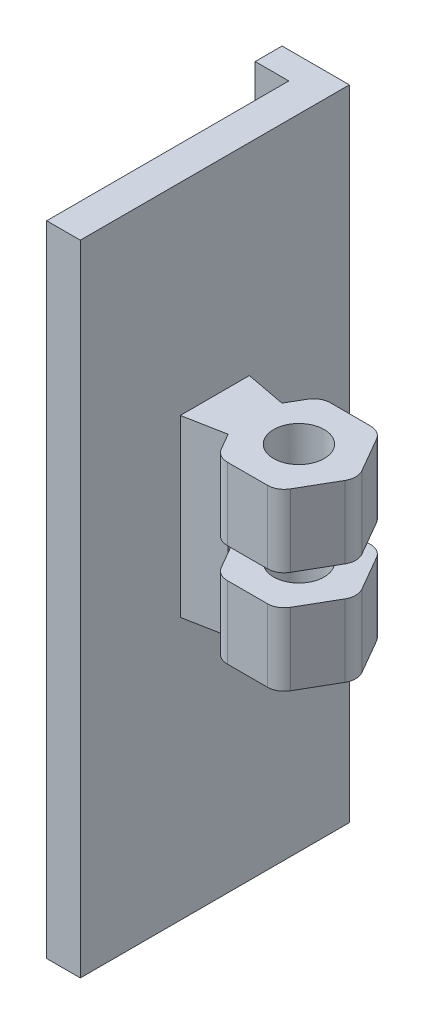
ISO-10303-21;
HEADER;
FILE_DESCRIPTION(('STEP AP214'),'2;1');
FILE_NAME('part.step','',(''),(''),'','','');
FILE_SCHEMA(('AUTOMOTIVE_DESIGN { 1 0 10303 214 1 1 1 1 }'));
ENDSEC;
DATA;
#1=APPLICATION_CONTEXT('core data for automotive mechanical design processes');
#2=APPLICATION_PROTOCOL_DEFINITION('international standard','automotive_design',2000,#1);
#3=PRODUCT_CONTEXT('',#1,'mechanical');
#4=PRODUCT('Part','Part','',(#3));
#5=PRODUCT_RELATED_PRODUCT_CATEGORY('part','',(#4));
#6=PRODUCT_DEFINITION_FORMATION('','',#4);
#7=PRODUCT_DEFINITION_CONTEXT('part definition',#1,'design');
#8=PRODUCT_DEFINITION('design','',#6,#7);
#9=PRODUCT_DEFINITION_SHAPE('','',#8);
#10=(LENGTH_UNIT() NAMED_UNIT(*) SI_UNIT(.MILLI.,.METRE.));
#11=(NAMED_UNIT(*) PLANE_ANGLE_UNIT() SI_UNIT($,.RADIAN.));
#12=(NAMED_UNIT(*) SI_UNIT($,.STERADIAN.) SOLID_ANGLE_UNIT());
#13=UNCERTAINTY_MEASURE_WITH_UNIT(LENGTH_MEASURE(1.E-05),#10,'distance_accuracy_value','');
#14=(GEOMETRIC_REPRESENTATION_CONTEXT(3) GLOBAL_UNCERTAINTY_ASSIGNED_CONTEXT((#13)) GLOBAL_UNIT_ASSIGNED_CONTEXT((#10,
#11,#12)) REPRESENTATION_CONTEXT('',''));
#15=CARTESIAN_POINT('',(0.,0.,0.));
#16=DIRECTION('',(0.,0.,1.));
#17=DIRECTION('',(1.,0.,0.));
#18=AXIS2_PLACEMENT_3D('',#15,#16,#17);
#19=CARTESIAN_POINT('',(2.05832704406993,-7.65,0.765));
#20=DIRECTION('',(0.866025403784441,0.,-0.499999999999996));
#21=DIRECTION('',(-0.499999999999996,0.,-0.866025403784441));
#22=AXIS2_PLACEMENT_3D('',#19,#20,#21);
#23=PLANE('',#22);
#24=DIRECTION('',(0.500000000000009,0.,0.866025403784434));
#25=VECTOR('',#24,1.);
#26=CARTESIAN_POINT('',(1.61665408813986,-9.175,0.));
#27=LINE('',#26,#25);
#28=CARTESIAN_POINT('',(1.84759419581571,-9.175,0.399999999999999));
#29=VERTEX_POINT('',#28);
#30=CARTESIAN_POINT('',(1.98615826042123,-9.175,0.640000000000004));
#31=VERTEX_POINT('',#30);
#32=EDGE_CURVE('E277',#29,#31,#27,.T.);
#33=ORIENTED_EDGE('',*,*,#32,.F.);
#34=DIRECTION('',(0.,-1.,0.));
#35=VECTOR('',#34,1.);
#36=CARTESIAN_POINT('',(1.84759419581572,-7.65,0.399999999999996));
#37=LINE('',#36,#35);
#38=CARTESIAN_POINT('',(1.84759419581572,-10.25,0.399999999999996));
#39=VERTEX_POINT('',#38);
#40=EDGE_CURVE('E422',#29,#39,#37,.T.);
#41=ORIENTED_EDGE('',*,*,#40,.T.);
#42=DIRECTION('',(0.499999999999996,0.,0.866025403784441));
#43=VECTOR('',#42,1.);
#44=CARTESIAN_POINT('',(2.05832704406993,-10.25,0.765));
#45=LINE('',#44,#43);
#46=CARTESIAN_POINT('',(1.98615826042123,-10.25,0.639999999999999));
#47=VERTEX_POINT('',#46);
#48=EDGE_CURVE('E402',#39,#47,#45,.T.);
#49=ORIENTED_EDGE('',*,*,#48,.T.);
#50=DIRECTION('',(0.,-1.,0.));
#51=VECTOR('',#50,1.);
#52=CARTESIAN_POINT('',(1.98615826042123,-7.65,0.639999999999999));
#53=LINE('',#52,#51);
#54=EDGE_CURVE('E480',#47,#31,#53,.F.);
#55=ORIENTED_EDGE('',*,*,#54,.T.);
#56=EDGE_LOOP('',(#33,#41,#49,#55));
#57=FACE_BOUND('',#56,.T.);
#58=ADVANCED_FACE('F35',(#57),#23,.F.);
#59=CARTESIAN_POINT('',(2.94167295593006,-7.65,0.765000000000004));
#60=DIRECTION('',(0.,0.,-1.));
#61=DIRECTION('',(-1.,0.,0.));
#62=AXIS2_PLACEMENT_3D('',#59,#60,#61);
#63=PLANE('',#62);
#64=DIRECTION('',(1.,0.,0.));
#65=VECTOR('',#64,1.);
#66=CARTESIAN_POINT('',(2.05832704406993,-9.175,0.765));
#67=LINE('',#66,#65);
#68=CARTESIAN_POINT('',(2.20266461136734,-9.175,0.765));
#69=VERTEX_POINT('',#68);
#70=CARTESIAN_POINT('',(2.79733538863265,-9.175,0.765000000000001));
#71=VERTEX_POINT('',#70);
#72=EDGE_CURVE('E276',#69,#71,#67,.T.);
#73=ORIENTED_EDGE('',*,*,#72,.F.);
#74=DIRECTION('',(0.,-1.,0.));
#75=VECTOR('',#74,1.);
#76=CARTESIAN_POINT('',(2.20266461136734,-7.65,0.765));
#77=LINE('',#76,#75);
#78=CARTESIAN_POINT('',(2.20266461136734,-10.25,0.765));
#79=VERTEX_POINT('',#78);
#80=EDGE_CURVE('E475',#69,#79,#77,.T.);
#81=ORIENTED_EDGE('',*,*,#80,.T.);
#82=DIRECTION('',(1.,0.,0.));
#83=VECTOR('',#82,1.);
#84=CARTESIAN_POINT('',(2.94167295593006,-10.25,0.765000000000004));
#85=LINE('',#84,#83);
#86=CARTESIAN_POINT('',(2.79733538863265,-10.25,0.765000000000003));
#87=VERTEX_POINT('',#86);
#88=EDGE_CURVE('E405',#79,#87,#85,.T.);
#89=ORIENTED_EDGE('',*,*,#88,.T.);
#90=DIRECTION('',(0.,-1.,0.));
#91=VECTOR('',#90,1.);
#92=CARTESIAN_POINT('',(2.79733538863265,-7.65,0.765000000000003));
#93=LINE('',#92,#91);
#94=EDGE_CURVE('E472',#87,#71,#93,.F.);
#95=ORIENTED_EDGE('',*,*,#94,.T.);
#96=EDGE_LOOP('',(#73,#81,#89,#95));
#97=FACE_BOUND('',#96,.T.);
#98=ADVANCED_FACE('F612',(#97),#63,.F.);
#99=CARTESIAN_POINT('',(3.38334591186012,-7.65,0.));
#100=DIRECTION('',(-0.866025403784438,0.,-0.500000000000001));
#101=DIRECTION('',(-0.500000000000001,0.,0.866025403784438));
#102=AXIS2_PLACEMENT_3D('',#99,#100,#101);
#103=PLANE('',#102);
#104=DIRECTION('',(0.500000000000002,0.,-0.866025403784438));
#105=VECTOR('',#104,1.);
#106=CARTESIAN_POINT('',(2.94167295593006,-9.175,0.765000000000001));
#107=LINE('',#106,#105);
#108=CARTESIAN_POINT('',(3.01384173957876,-9.175,0.640000000000003));
#109=VERTEX_POINT('',#108);
#110=CARTESIAN_POINT('',(3.31117712821142,-9.175,0.125000000000002));
#111=VERTEX_POINT('',#110);
#112=EDGE_CURVE('E50',#109,#111,#107,.T.);
#113=ORIENTED_EDGE('',*,*,#112,.F.);
#114=DIRECTION('',(0.,-1.,0.));
#115=VECTOR('',#114,1.);
#116=CARTESIAN_POINT('',(3.01384173957876,-7.65,0.640000000000003));
#117=LINE('',#116,#115);
#118=CARTESIAN_POINT('',(3.01384173957876,-10.25,0.640000000000003));
#119=VERTEX_POINT('',#118);
#120=EDGE_CURVE('E494',#109,#119,#117,.T.);
#121=ORIENTED_EDGE('',*,*,#120,.T.);
#122=DIRECTION('',(0.500000000000001,0.,-0.866025403784438));
#123=VECTOR('',#122,1.);
#124=CARTESIAN_POINT('',(3.38334591186012,-10.25,0.));
#125=LINE('',#124,#123);
#126=CARTESIAN_POINT('',(3.31117712821142,-10.25,0.125000000000002));
#127=VERTEX_POINT('',#126);
#128=EDGE_CURVE('E408',#119,#127,#125,.T.);
#129=ORIENTED_EDGE('',*,*,#128,.T.);
#130=DIRECTION('',(0.,-1.,0.));
#131=VECTOR('',#130,1.);
#132=CARTESIAN_POINT('',(3.31117712821142,-7.65,0.125000000000002));
#133=LINE('',#132,#131);
#134=EDGE_CURVE('E491',#127,#111,#133,.F.);
#135=ORIENTED_EDGE('',*,*,#134,.T.);
#136=EDGE_LOOP('',(#113,#121,#129,#135));
#137=FACE_BOUND('',#136,.T.);
#138=ADVANCED_FACE('F504',(#137),#103,.F.);
#139=CARTESIAN_POINT('',(2.94167295593006,-7.65,-0.764999999999999));
#140=DIRECTION('',(-0.866025403784441,0.,0.499999999999996));
#141=DIRECTION('',(0.499999999999996,0.,0.866025403784441));
#142=AXIS2_PLACEMENT_3D('',#139,#140,#141);
#143=PLANE('',#142);
#144=DIRECTION('',(-0.499999999999997,0.,-0.86602540378444));
#145=VECTOR('',#144,1.);
#146=CARTESIAN_POINT('',(3.38334591186012,-9.175,0.));
#147=LINE('',#146,#145);
#148=CARTESIAN_POINT('',(3.31117712821142,-9.175,-0.124999999999997));
#149=VERTEX_POINT('',#148);
#150=CARTESIAN_POINT('',(3.01384173957876,-9.175,-0.639999999999998));
#151=VERTEX_POINT('',#150);
#152=EDGE_CURVE('E523',#149,#151,#147,.T.);
#153=ORIENTED_EDGE('',*,*,#152,.F.);
#154=DIRECTION('',(0.,-1.,0.));
#155=VECTOR('',#154,1.);
#156=CARTESIAN_POINT('',(3.31117712821142,-7.65,-0.124999999999997));
#157=LINE('',#156,#155);
#158=CARTESIAN_POINT('',(3.31117712821142,-10.25,-0.124999999999997));
#159=VERTEX_POINT('',#158);
#160=EDGE_CURVE('E483',#149,#159,#157,.T.);
#161=ORIENTED_EDGE('',*,*,#160,.T.);
#162=DIRECTION('',(-0.499999999999996,0.,-0.866025403784441));
#163=VECTOR('',#162,1.);
#164=CARTESIAN_POINT('',(2.94167295593006,-10.25,-0.764999999999999));
#165=LINE('',#164,#163);
#166=CARTESIAN_POINT('',(3.01384173957876,-10.25,-0.639999999999998));
#167=VERTEX_POINT('',#166);
#168=EDGE_CURVE('E411',#159,#167,#165,.T.);
#169=ORIENTED_EDGE('',*,*,#168,.T.);
#170=DIRECTION('',(0.,-1.,0.));
#171=VECTOR('',#170,1.);
#172=CARTESIAN_POINT('',(3.01384173957876,-7.65,-0.639999999999998));
#173=LINE('',#172,#171);
#174=EDGE_CURVE('E487',#167,#151,#173,.F.);
#175=ORIENTED_EDGE('',*,*,#174,.T.);
#176=EDGE_LOOP('',(#153,#161,#169,#175));
#177=FACE_BOUND('',#176,.T.);
#178=ADVANCED_FACE('F518',(#177),#143,.F.);
#179=CARTESIAN_POINT('',(2.05832704406993,-7.65,-0.765));
#180=DIRECTION('',(0.,0.,1.));
#181=DIRECTION('',(1.,0.,0.));
#182=AXIS2_PLACEMENT_3D('',#179,#180,#181);
#183=PLANE('',#182);
#184=DIRECTION('',(-1.,0.,0.));
#185=VECTOR('',#184,1.);
#186=CARTESIAN_POINT('',(2.94167295593006,-9.175,-0.764999999999996));
#187=LINE('',#186,#185);
#188=CARTESIAN_POINT('',(2.79733538863266,-9.175,-0.764999999999997));
#189=VERTEX_POINT('',#188);
#190=CARTESIAN_POINT('',(2.20266461136734,-9.175,-0.765));
#191=VERTEX_POINT('',#190);
#192=EDGE_CURVE('E260',#189,#191,#187,.T.);
#193=ORIENTED_EDGE('',*,*,#192,.F.);
#194=DIRECTION('',(0.,-1.,0.));
#195=VECTOR('',#194,1.);
#196=CARTESIAN_POINT('',(2.79733538863265,-7.65,-0.764999999999999));
#197=LINE('',#196,#195);
#198=CARTESIAN_POINT('',(2.79733538863265,-10.25,-0.764999999999999));
#199=VERTEX_POINT('',#198);
#200=EDGE_CURVE('E453',#189,#199,#197,.T.);
#201=ORIENTED_EDGE('',*,*,#200,.T.);
#202=DIRECTION('',(-1.,0.,0.));
#203=VECTOR('',#202,1.);
#204=CARTESIAN_POINT('',(2.05832704406993,-10.25,-0.765));
#205=LINE('',#204,#203);
#206=CARTESIAN_POINT('',(2.20266461136734,-10.25,-0.765));
#207=VERTEX_POINT('',#206);
#208=EDGE_CURVE('E414',#199,#207,#205,.T.);
#209=ORIENTED_EDGE('',*,*,#208,.T.);
#210=DIRECTION('',(0.,-1.,0.));
#211=VECTOR('',#210,1.);
#212=CARTESIAN_POINT('',(2.20266461136734,-7.65,-0.765));
#213=LINE('',#212,#211);
#214=EDGE_CURVE('E458',#207,#191,#213,.F.);
#215=ORIENTED_EDGE('',*,*,#214,.T.);
#216=EDGE_LOOP('',(#193,#201,#209,#215));
#217=FACE_BOUND('',#216,.T.);
#218=ADVANCED_FACE('F525',(#217),#183,.F.);
#219=CARTESIAN_POINT('',(1.84759419581572,-7.65,-0.400000000000004));
#220=DIRECTION('',(0.866025403784441,0.,0.499999999999996));
#221=DIRECTION('',(0.499999999999996,0.,-0.866025403784441));
#222=AXIS2_PLACEMENT_3D('',#219,#220,#221);
#223=PLANE('',#222);
#224=DIRECTION('',(-0.500000000000006,0.,0.866025403784435));
#225=VECTOR('',#224,1.);
#226=CARTESIAN_POINT('',(2.05832704406993,-9.175,-0.765));
#227=LINE('',#226,#225);
#228=CARTESIAN_POINT('',(1.98615826042123,-9.175,-0.640000000000003));
#229=VERTEX_POINT('',#228);
#230=CARTESIAN_POINT('',(1.84759419581572,-9.175,-0.400000000000006));
#231=VERTEX_POINT('',#230);
#232=EDGE_CURVE('E257',#229,#231,#227,.T.);
#233=ORIENTED_EDGE('',*,*,#232,.F.);
#234=DIRECTION('',(0.,-1.,0.));
#235=VECTOR('',#234,1.);
#236=CARTESIAN_POINT('',(1.98615826042123,-7.65,-0.639999999999999));
#237=LINE('',#236,#235);
#238=CARTESIAN_POINT('',(1.98615826042123,-10.25,-0.639999999999999));
#239=VERTEX_POINT('',#238);
#240=EDGE_CURVE('E439',#229,#239,#237,.T.);
#241=ORIENTED_EDGE('',*,*,#240,.T.);
#242=DIRECTION('',(-0.499999999999996,0.,0.866025403784441));
#243=VECTOR('',#242,1.);
#244=CARTESIAN_POINT('',(1.84759419581572,-10.25,-0.400000000000004));
#245=LINE('',#244,#243);
#246=CARTESIAN_POINT('',(1.84759419581572,-10.25,-0.400000000000004));
#247=VERTEX_POINT('',#246);
#248=EDGE_CURVE('E378',#239,#247,#245,.T.);
#249=ORIENTED_EDGE('',*,*,#248,.T.);
#250=DIRECTION('',(0.,-1.,0.));
#251=VECTOR('',#250,1.);
#252=CARTESIAN_POINT('',(1.84759419581572,-7.65,-0.400000000000004));
#253=LINE('',#252,#251);
#254=EDGE_CURVE('E396',#231,#247,#253,.T.);
#255=ORIENTED_EDGE('',*,*,#254,.F.);
#256=EDGE_LOOP('',(#233,#241,#249,#255));
#257=FACE_BOUND('',#256,.T.);
#258=ADVANCED_FACE('F534',(#257),#223,.F.);
#259=CARTESIAN_POINT('',(2.5,-7.65,0.));
#260=DIRECTION('',(0.,-1.,0.));
#261=DIRECTION('',(1.,0.,0.));
#262=AXIS2_PLACEMENT_3D('',#259,#260,#261);
#263=CYLINDRICAL_SURFACE('',#262,0.375);
#264=CARTESIAN_POINT('',(2.5,-10.25,0.));
#265=DIRECTION('',(0.,1.,0.));
#266=DIRECTION('',(-1.,0.,0.));
#267=AXIS2_PLACEMENT_3D('',#264,#265,#266);
#268=CIRCLE('',#267,0.375);
#269=CARTESIAN_POINT('',(2.125,-10.25,0.));
#270=VERTEX_POINT('',#269);
#271=EDGE_CURVE('E368',#270,#270,#268,.T.);
#272=ORIENTED_EDGE('',*,*,#271,.F.);
#273=EDGE_LOOP('',(#272));
#274=FACE_BOUND('',#273,.T.);
#275=CARTESIAN_POINT('',(2.5,-9.175,0.));
#276=DIRECTION('',(0.,1.,0.));
#277=DIRECTION('',(0.,0.,1.));
#278=AXIS2_PLACEMENT_3D('',#275,#276,#277);
#279=CIRCLE('',#278,0.375);
#280=CARTESIAN_POINT('',(2.5,-9.175,0.375));
#281=VERTEX_POINT('',#280);
#282=EDGE_CURVE('E308',#281,#281,#279,.T.);
#283=ORIENTED_EDGE('',*,*,#282,.T.);
#284=EDGE_LOOP('',(#283));
#285=FACE_BOUND('',#284,.T.);
#286=ADVANCED_FACE('F864',(#274,#285),#263,.F.);
#287=CARTESIAN_POINT('',(2.20266461136734,-7.65,-0.515));
#288=DIRECTION('',(0.,-1.,0.));
#289=DIRECTION('',(1.,0.,0.));
#290=AXIS2_PLACEMENT_3D('',#287,#288,#289);
#291=CYLINDRICAL_SURFACE('',#290,0.25);
#292=ORIENTED_EDGE('',*,*,#240,.F.);
#293=CARTESIAN_POINT('',(2.20266461136734,-9.175,-0.515));
#294=DIRECTION('',(0.,1.,0.));
#295=DIRECTION('',(0.,0.,1.));
#296=AXIS2_PLACEMENT_3D('',#293,#294,#295);
#297=CIRCLE('',#296,0.25);
#298=EDGE_CURVE('E305',#229,#191,#297,.F.);
#299=ORIENTED_EDGE('',*,*,#298,.T.);
#300=ORIENTED_EDGE('',*,*,#214,.F.);
#301=CARTESIAN_POINT('',(2.20266461136734,-10.25,-0.515));
#302=DIRECTION('',(0.,-1.,0.));
#303=DIRECTION('',(0.,0.,-1.));
#304=AXIS2_PLACEMENT_3D('',#301,#302,#303);
#305=CIRCLE('',#304,0.25);
#306=EDGE_CURVE('E451',#239,#207,#305,.T.);
#307=ORIENTED_EDGE('',*,*,#306,.F.);
#308=EDGE_LOOP('',(#292,#299,#300,#307));
#309=FACE_BOUND('',#308,.T.);
#310=ADVANCED_FACE('F532',(#309),#291,.T.);
#311=CARTESIAN_POINT('',(2.20266461136734,-7.65,0.515));
#312=DIRECTION('',(0.,-1.,0.));
#313=DIRECTION('',(1.,0.,0.));
#314=AXIS2_PLACEMENT_3D('',#311,#312,#313);
#315=CYLINDRICAL_SURFACE('',#314,0.25);
#316=ORIENTED_EDGE('',*,*,#80,.F.);
#317=CARTESIAN_POINT('',(2.20266461136734,-9.175,0.515));
#318=DIRECTION('',(0.,1.,0.));
#319=DIRECTION('',(0.,0.,1.));
#320=AXIS2_PLACEMENT_3D('',#317,#318,#319);
#321=CIRCLE('',#320,0.25);
#322=EDGE_CURVE('E302',#69,#31,#321,.F.);
#323=ORIENTED_EDGE('',*,*,#322,.T.);
#324=ORIENTED_EDGE('',*,*,#54,.F.);
#325=CARTESIAN_POINT('',(2.20266461136734,-10.25,0.515));
#326=DIRECTION('',(0.,-1.,0.));
#327=DIRECTION('',(0.,0.,-1.));
#328=AXIS2_PLACEMENT_3D('',#325,#326,#327);
#329=CIRCLE('',#328,0.25);
#330=EDGE_CURVE('E449',#79,#47,#329,.T.);
#331=ORIENTED_EDGE('',*,*,#330,.F.);
#332=EDGE_LOOP('',(#316,#323,#324,#331));
#333=FACE_BOUND('',#332,.T.);
#334=ADVANCED_FACE('F609',(#333),#315,.T.);
#335=CARTESIAN_POINT('',(2.79733538863265,-7.65,-0.514999999999999));
#336=DIRECTION('',(0.,-1.,0.));
#337=DIRECTION('',(1.,0.,0.));
#338=AXIS2_PLACEMENT_3D('',#335,#336,#337);
#339=CYLINDRICAL_SURFACE('',#338,0.25);
#340=ORIENTED_EDGE('',*,*,#200,.F.);
#341=CARTESIAN_POINT('',(2.79733538863265,-9.175,-0.514999999999999));
#342=DIRECTION('',(0.,1.,0.));
#343=DIRECTION('',(0.,0.,1.));
#344=AXIS2_PLACEMENT_3D('',#341,#342,#343);
#345=CIRCLE('',#344,0.25);
#346=EDGE_CURVE('E299',#189,#151,#345,.F.);
#347=ORIENTED_EDGE('',*,*,#346,.T.);
#348=ORIENTED_EDGE('',*,*,#174,.F.);
#349=CARTESIAN_POINT('',(2.79733538863265,-10.25,-0.514999999999999));
#350=DIRECTION('',(0.,-1.,0.));
#351=DIRECTION('',(0.,0.,-1.));
#352=AXIS2_PLACEMENT_3D('',#349,#350,#351);
#353=CIRCLE('',#352,0.25);
#354=EDGE_CURVE('E447',#199,#167,#353,.T.);
#355=ORIENTED_EDGE('',*,*,#354,.F.);
#356=EDGE_LOOP('',(#340,#347,#348,#355));
#357=FACE_BOUND('',#356,.T.);
#358=ADVANCED_FACE('F521',(#357),#339,.T.);
#359=CARTESIAN_POINT('',(2.79733538863265,-7.65,0.515000000000003));
#360=DIRECTION('',(0.,-1.,0.));
#361=DIRECTION('',(1.,0.,0.));
#362=AXIS2_PLACEMENT_3D('',#359,#360,#361);
#363=CYLINDRICAL_SURFACE('',#362,0.25);
#364=ORIENTED_EDGE('',*,*,#120,.F.);
#365=CARTESIAN_POINT('',(2.79733538863265,-9.175,0.515000000000003));
#366=DIRECTION('',(0.,1.,0.));
#367=DIRECTION('',(0.,0.,1.));
#368=AXIS2_PLACEMENT_3D('',#365,#366,#367);
#369=CIRCLE('',#368,0.25);
#370=EDGE_CURVE('E270',#109,#71,#369,.F.);
#371=ORIENTED_EDGE('',*,*,#370,.T.);
#372=ORIENTED_EDGE('',*,*,#94,.F.);
#373=CARTESIAN_POINT('',(2.79733538863265,-10.25,0.515000000000003));
#374=DIRECTION('',(0.,-1.,0.));
#375=DIRECTION('',(0.,0.,-1.));
#376=AXIS2_PLACEMENT_3D('',#373,#374,#375);
#377=CIRCLE('',#376,0.25);
#378=EDGE_CURVE('E445',#119,#87,#377,.T.);
#379=ORIENTED_EDGE('',*,*,#378,.F.);
#380=EDGE_LOOP('',(#364,#371,#372,#379));
#381=FACE_BOUND('',#380,.T.);
#382=ADVANCED_FACE('F615',(#381),#363,.T.);
#383=CARTESIAN_POINT('',(3.09467077726531,-7.65,0.));
#384=DIRECTION('',(0.,-1.,0.));
#385=DIRECTION('',(1.,0.,0.));
#386=AXIS2_PLACEMENT_3D('',#383,#384,#385);
#387=CYLINDRICAL_SURFACE('',#386,0.25);
#388=ORIENTED_EDGE('',*,*,#160,.F.);
#389=CARTESIAN_POINT('',(3.09467077726531,-9.175,0.));
#390=DIRECTION('',(0.,1.,0.));
#391=DIRECTION('',(0.,0.,1.));
#392=AXIS2_PLACEMENT_3D('',#389,#390,#391);
#393=CIRCLE('',#392,0.25);
#394=EDGE_CURVE('E43',#149,#111,#393,.F.);
#395=ORIENTED_EDGE('',*,*,#394,.T.);
#396=ORIENTED_EDGE('',*,*,#134,.F.);
#397=CARTESIAN_POINT('',(3.09467077726531,-10.25,0.));
#398=DIRECTION('',(0.,-1.,0.));
#399=DIRECTION('',(0.,0.,-1.));
#400=AXIS2_PLACEMENT_3D('',#397,#398,#399);
#401=CIRCLE('',#400,0.25);
#402=EDGE_CURVE('E443',#159,#127,#401,.T.);
#403=ORIENTED_EDGE('',*,*,#402,.F.);
#404=EDGE_LOOP('',(#388,#395,#396,#403));
#405=FACE_BOUND('',#404,.T.);
#406=ADVANCED_FACE('F500',(#405),#387,.T.);
#407=CARTESIAN_POINT('',(0.750000000000002,-7.65,2.));
#408=DIRECTION('',(1.,0.,0.));
#409=DIRECTION('',(0.,0.,-1.));
#410=AXIS2_PLACEMENT_3D('',#407,#408,#409);
#411=PLANE('',#410);
#412=DIRECTION('',(0.,1.,0.));
#413=VECTOR('',#412,1.);
#414=CARTESIAN_POINT('',(0.750000000000006,-4.65,-1.60000000000001));
#415=LINE('',#414,#413);
#416=CARTESIAN_POINT('',(0.750000000000005,-14.15,-1.6));
#417=VERTEX_POINT('',#416);
#418=CARTESIAN_POINT('',(0.750000000000006,-4.65,-1.60000000000001));
#419=VERTEX_POINT('',#418);
#420=EDGE_CURVE('E325',#417,#419,#415,.T.);
#421=ORIENTED_EDGE('',*,*,#420,.F.);
#422=DIRECTION('',(0.,0.,1.));
#423=VECTOR('',#422,1.);
#424=CARTESIAN_POINT('',(0.750000000000006,-14.15,-2.));
#425=LINE('',#424,#423);
#426=CARTESIAN_POINT('',(0.749999999999995,-14.15,2.));
#427=VERTEX_POINT('',#426);
#428=EDGE_CURVE('E349',#417,#427,#425,.T.);
#429=ORIENTED_EDGE('',*,*,#428,.T.);
#430=DIRECTION('',(0.,-1.,0.));
#431=VECTOR('',#430,1.);
#432=CARTESIAN_POINT('',(0.750000000000002,-7.65,2.));
#433=LINE('',#432,#431);
#434=CARTESIAN_POINT('',(0.749999999999996,-4.65,2.));
#435=VERTEX_POINT('',#434);
#436=EDGE_CURVE('E431',#435,#427,#433,.T.);
#437=ORIENTED_EDGE('',*,*,#436,.F.);
#438=DIRECTION('',(0.,0.,1.));
#439=VECTOR('',#438,1.);
#440=CARTESIAN_POINT('',(0.750000000000007,-4.65,-2.00000000000001));
#441=LINE('',#440,#439);
#442=EDGE_CURVE('E344',#419,#435,#441,.T.);
#443=ORIENTED_EDGE('',*,*,#442,.F.);
#444=EDGE_LOOP('',(#421,#429,#437,#443));
#445=FACE_BOUND('',#444,.T.);
#446=ADVANCED_FACE('F621',(#445),#411,.F.);
#447=CARTESIAN_POINT('',(0.,-7.65,0.));
#448=DIRECTION('',(0.,-1.,0.));
#449=DIRECTION('',(0.,0.,-1.));
#450=AXIS2_PLACEMENT_3D('',#447,#448,#449);
#451=PLANE('',#450);
#452=DIRECTION('',(-1.,0.,0.));
#453=VECTOR('',#452,1.);
#454=CARTESIAN_POINT('',(2.05832704406993,-7.65,-0.765));
#455=LINE('',#454,#453);
#456=CARTESIAN_POINT('',(2.79733538863265,-7.65,-0.764999999999999));
#457=VERTEX_POINT('',#456);
#458=CARTESIAN_POINT('',(2.20266461136734,-7.65,-0.765));
#459=VERTEX_POINT('',#458);
#460=EDGE_CURVE('E391',#457,#459,#455,.T.);
#461=ORIENTED_EDGE('',*,*,#460,.T.);
#462=CARTESIAN_POINT('',(2.20266461136734,-7.65,-0.515));
#463=DIRECTION('',(0.,-1.,0.));
#464=DIRECTION('',(0.,0.,-1.));
#465=AXIS2_PLACEMENT_3D('',#462,#463,#464);
#466=CIRCLE('',#465,0.25);
#467=CARTESIAN_POINT('',(1.98615826042123,-7.65,-0.639999999999999));
#468=VERTEX_POINT('',#467);
#469=EDGE_CURVE('E469',#459,#468,#466,.F.);
#470=ORIENTED_EDGE('',*,*,#469,.T.);
#471=DIRECTION('',(-0.499999999999996,0.,0.866025403784441));
#472=VECTOR('',#471,1.);
#473=CARTESIAN_POINT('',(1.84759419581572,-7.65,-0.400000000000004));
#474=LINE('',#473,#472);
#475=CARTESIAN_POINT('',(1.84759419581572,-7.65,-0.400000000000004));
#476=VERTEX_POINT('',#475);
#477=EDGE_CURVE('E394',#468,#476,#474,.T.);
#478=ORIENTED_EDGE('',*,*,#477,.T.);
#479=DIRECTION('',(-0.982526008207231,0.,-0.186125342703145));
#480=VECTOR('',#479,1.);
#481=CARTESIAN_POINT('',(1.25,-7.65,-0.513205577831539));
#482=LINE('',#481,#480);
#483=CARTESIAN_POINT('',(1.25,-7.65,-0.513205577831539));
#484=VERTEX_POINT('',#483);
#485=EDGE_CURVE('E375',#476,#484,#482,.T.);
#486=ORIENTED_EDGE('',*,*,#485,.T.);
#487=DIRECTION('',(0.,0.,1.));
#488=VECTOR('',#487,1.);
#489=CARTESIAN_POINT('',(1.25,-7.65,0.));
#490=LINE('',#489,#488);
#491=CARTESIAN_POINT('',(1.25,-7.65,0.513205577831541));
#492=VERTEX_POINT('',#491);
#493=EDGE_CURVE('E366',#484,#492,#490,.T.);
#494=ORIENTED_EDGE('',*,*,#493,.T.);
#495=DIRECTION('',(0.982526008207229,0.,-0.186125342703161));
#496=VECTOR('',#495,1.);
#497=CARTESIAN_POINT('',(1.84759419581572,-7.65,0.399999999999996));
#498=LINE('',#497,#496);
#499=CARTESIAN_POINT('',(1.84759419581572,-7.65,0.399999999999996));
#500=VERTEX_POINT('',#499);
#501=EDGE_CURVE('E377',#492,#500,#498,.T.);
#502=ORIENTED_EDGE('',*,*,#501,.T.);
#503=DIRECTION('',(0.499999999999996,0.,0.866025403784441));
#504=VECTOR('',#503,1.);
#505=CARTESIAN_POINT('',(2.05832704406993,-7.65,0.765));
#506=LINE('',#505,#504);
#507=CARTESIAN_POINT('',(1.98615826042123,-7.65,0.639999999999999));
#508=VERTEX_POINT('',#507);
#509=EDGE_CURVE('E380',#500,#508,#506,.T.);
#510=ORIENTED_EDGE('',*,*,#509,.T.);
#511=CARTESIAN_POINT('',(2.20266461136734,-7.65,0.515));
#512=DIRECTION('',(0.,-1.,0.));
#513=DIRECTION('',(0.,0.,-1.));
#514=AXIS2_PLACEMENT_3D('',#511,#512,#513);
#515=CIRCLE('',#514,0.25);
#516=CARTESIAN_POINT('',(2.20266461136734,-7.65,0.765));
#517=VERTEX_POINT('',#516);
#518=EDGE_CURVE('E467',#508,#517,#515,.F.);
#519=ORIENTED_EDGE('',*,*,#518,.T.);
#520=DIRECTION('',(1.,0.,0.));
#521=VECTOR('',#520,1.);
#522=CARTESIAN_POINT('',(2.94167295593006,-7.65,0.765000000000004));
#523=LINE('',#522,#521);
#524=CARTESIAN_POINT('',(2.79733538863265,-7.65,0.765000000000003));
#525=VERTEX_POINT('',#524);
#526=EDGE_CURVE('E383',#517,#525,#523,.T.);
#527=ORIENTED_EDGE('',*,*,#526,.T.);
#528=CARTESIAN_POINT('',(2.79733538863265,-7.65,0.515000000000003));
#529=DIRECTION('',(0.,-1.,0.));
#530=DIRECTION('',(0.,0.,-1.));
#531=AXIS2_PLACEMENT_3D('',#528,#529,#530);
#532=CIRCLE('',#531,0.25);
#533=CARTESIAN_POINT('',(3.01384173957876,-7.65,0.640000000000003));
#534=VERTEX_POINT('',#533);
#535=EDGE_CURVE('E463',#525,#534,#532,.F.);
#536=ORIENTED_EDGE('',*,*,#535,.T.);
#537=DIRECTION('',(0.500000000000001,0.,-0.866025403784438));
#538=VECTOR('',#537,1.);
#539=CARTESIAN_POINT('',(3.38334591186012,-7.65,0.));
#540=LINE('',#539,#538);
#541=CARTESIAN_POINT('',(3.31117712821142,-7.65,0.125000000000002));
#542=VERTEX_POINT('',#541);
#543=EDGE_CURVE('E386',#534,#542,#540,.T.);
#544=ORIENTED_EDGE('',*,*,#543,.T.);
#545=CARTESIAN_POINT('',(3.09467077726531,-7.65,0.));
#546=DIRECTION('',(0.,-1.,0.));
#547=DIRECTION('',(0.,0.,-1.));
#548=AXIS2_PLACEMENT_3D('',#545,#546,#547);
#549=CIRCLE('',#548,0.25);
#550=CARTESIAN_POINT('',(3.31117712821142,-7.65,-0.124999999999997));
#551=VERTEX_POINT('',#550);
#552=EDGE_CURVE('E461',#542,#551,#549,.F.);
#553=ORIENTED_EDGE('',*,*,#552,.T.);
#554=DIRECTION('',(-0.499999999999996,0.,-0.866025403784441));
#555=VECTOR('',#554,1.);
#556=CARTESIAN_POINT('',(2.94167295593006,-7.65,-0.764999999999999));
#557=LINE('',#556,#555);
#558=CARTESIAN_POINT('',(3.01384173957876,-7.65,-0.639999999999998));
#559=VERTEX_POINT('',#558);
#560=EDGE_CURVE('E389',#551,#559,#557,.T.);
#561=ORIENTED_EDGE('',*,*,#560,.T.);
#562=CARTESIAN_POINT('',(2.79733538863265,-7.65,-0.514999999999999));
#563=DIRECTION('',(0.,-1.,0.));
#564=DIRECTION('',(0.,0.,-1.));
#565=AXIS2_PLACEMENT_3D('',#562,#563,#564);
#566=CIRCLE('',#565,0.25);
#567=EDGE_CURVE('E465',#559,#457,#566,.F.);
#568=ORIENTED_EDGE('',*,*,#567,.T.);
#569=EDGE_LOOP('',(#461,#470,#478,#486,#494,#502,#510,#519,#527,#536,#544,#553,#561,#568));
#570=FACE_BOUND('',#569,.T.);
#571=CARTESIAN_POINT('',(2.5,-7.65,0.));
#572=DIRECTION('',(0.,1.,0.));
#573=DIRECTION('',(-1.,0.,0.));
#574=AXIS2_PLACEMENT_3D('',#571,#572,#573);
#575=CIRCLE('',#574,0.375);
#576=CARTESIAN_POINT('',(2.125,-7.65,0.));
#577=VERTEX_POINT('',#576);
#578=EDGE_CURVE('E369',#577,#577,#575,.T.);
#579=ORIENTED_EDGE('',*,*,#578,.F.);
#580=EDGE_LOOP('',(#579));
#581=FACE_BOUND('',#580,.T.);
#582=ADVANCED_FACE('F562',(#570,#581),#451,.F.);
#583=CARTESIAN_POINT('',(0.,-10.25,0.));
#584=DIRECTION('',(0.,-1.,0.));
#585=DIRECTION('',(0.,0.,-1.));
#586=AXIS2_PLACEMENT_3D('',#583,#584,#585);
#587=PLANE('',#586);
#588=ORIENTED_EDGE('',*,*,#248,.F.);
#589=ORIENTED_EDGE('',*,*,#306,.T.);
#590=ORIENTED_EDGE('',*,*,#208,.F.);
#591=ORIENTED_EDGE('',*,*,#354,.T.);
#592=ORIENTED_EDGE('',*,*,#168,.F.);
#593=ORIENTED_EDGE('',*,*,#402,.T.);
#594=ORIENTED_EDGE('',*,*,#128,.F.);
#595=ORIENTED_EDGE('',*,*,#378,.T.);
#596=ORIENTED_EDGE('',*,*,#88,.F.);
#597=ORIENTED_EDGE('',*,*,#330,.T.);
#598=ORIENTED_EDGE('',*,*,#48,.F.);
#599=DIRECTION('',(0.982526008207229,0.,-0.186125342703161));
#600=VECTOR('',#599,1.);
#601=CARTESIAN_POINT('',(1.84759419581572,-10.25,0.399999999999996));
#602=LINE('',#601,#600);
#603=CARTESIAN_POINT('',(1.25,-10.25,0.513205577831541));
#604=VERTEX_POINT('',#603);
#605=EDGE_CURVE('E399',#604,#39,#602,.T.);
#606=ORIENTED_EDGE('',*,*,#605,.F.);
#607=DIRECTION('',(0.,0.,1.));
#608=VECTOR('',#607,1.);
#609=CARTESIAN_POINT('',(1.25,-10.25,0.));
#610=LINE('',#609,#608);
#611=CARTESIAN_POINT('',(1.25,-10.25,-0.513205577831539));
#612=VERTEX_POINT('',#611);
#613=EDGE_CURVE('E364',#612,#604,#610,.T.);
#614=ORIENTED_EDGE('',*,*,#613,.F.);
#615=DIRECTION('',(-0.982526008207231,0.,-0.186125342703145));
#616=VECTOR('',#615,1.);
#617=CARTESIAN_POINT('',(1.25,-10.25,-0.513205577831539));
#618=LINE('',#617,#616);
#619=EDGE_CURVE('E372',#247,#612,#618,.T.);
#620=ORIENTED_EDGE('',*,*,#619,.F.);
#621=EDGE_LOOP('',(#588,#589,#590,#591,#592,#593,#594,#595,#596,#597,#598,#606,#614,#620));
#622=FACE_BOUND('',#621,.T.);
#623=ORIENTED_EDGE('',*,*,#271,.T.);
#624=EDGE_LOOP('',(#623));
#625=FACE_BOUND('',#624,.T.);
#626=ADVANCED_FACE('F510',(#622,#625),#587,.T.);
#627=CARTESIAN_POINT('',(1.25,-7.65,-0.513205577831539));
#628=DIRECTION('',(-0.186125342703145,0.,0.982526008207232));
#629=DIRECTION('',(0.982526008207232,0.,0.186125342703145));
#630=AXIS2_PLACEMENT_3D('',#627,#628,#629);
#631=PLANE('',#630);
#632=ORIENTED_EDGE('',*,*,#619,.T.);
#633=DIRECTION('',(0.,-1.,0.));
#634=VECTOR('',#633,1.);
#635=CARTESIAN_POINT('',(1.25,-7.65,-0.513205577831539));
#636=LINE('',#635,#634);
#637=EDGE_CURVE('E436',#484,#612,#636,.T.);
#638=ORIENTED_EDGE('',*,*,#637,.F.);
#639=ORIENTED_EDGE('',*,*,#485,.F.);
#640=CARTESIAN_POINT('',(1.84759419581572,-8.725,-0.400000000000006));
#641=VERTEX_POINT('',#640);
#642=EDGE_CURVE('E419',#476,#641,#253,.T.);
#643=ORIENTED_EDGE('',*,*,#642,.T.);
#644=DIRECTION('',(0.,1.,0.));
#645=VECTOR('',#644,1.);
#646=CARTESIAN_POINT('',(1.84759419581571,-7.65,-0.400000000000005));
#647=LINE('',#646,#645);
#648=EDGE_CURVE('E323',#231,#641,#647,.T.);
#649=ORIENTED_EDGE('',*,*,#648,.F.);
#650=ORIENTED_EDGE('',*,*,#254,.T.);
#651=EDGE_LOOP('',(#632,#638,#639,#643,#649,#650));
#652=FACE_BOUND('',#651,.T.);
#653=ADVANCED_FACE('F538',(#652),#631,.F.);
#654=CARTESIAN_POINT('',(0.750000000000001,-7.65,-2.));
#655=DIRECTION('',(0.,0.,1.));
#656=DIRECTION('',(1.,0.,0.));
#657=AXIS2_PLACEMENT_3D('',#654,#655,#656);
#658=PLANE('',#657);
#659=DIRECTION('',(0.,-1.,0.));
#660=VECTOR('',#659,1.);
#661=CARTESIAN_POINT('',(1.25,-7.65,-2.));
#662=LINE('',#661,#660);
#663=CARTESIAN_POINT('',(1.25000000000001,-4.65,-2.));
#664=VERTEX_POINT('',#663);
#665=CARTESIAN_POINT('',(1.25000000000001,-14.15,-2.));
#666=VERTEX_POINT('',#665);
#667=EDGE_CURVE('E434',#664,#666,#662,.T.);
#668=ORIENTED_EDGE('',*,*,#667,.T.);
#669=DIRECTION('',(-1.,0.,0.));
#670=VECTOR('',#669,1.);
#671=CARTESIAN_POINT('',(1.25000000000001,-14.15,-2.));
#672=LINE('',#671,#670);
#673=CARTESIAN_POINT('',(0.250000000000006,-14.15,-2.00000000000001));
#674=VERTEX_POINT('',#673);
#675=EDGE_CURVE('E356',#666,#674,#672,.T.);
#676=ORIENTED_EDGE('',*,*,#675,.T.);
#677=DIRECTION('',(0.,-1.,0.));
#678=VECTOR('',#677,1.);
#679=CARTESIAN_POINT('',(0.250000000000007,-4.65,-2.00000000000001));
#680=LINE('',#679,#678);
#681=CARTESIAN_POINT('',(0.250000000000007,-4.65,-2.00000000000001));
#682=VERTEX_POINT('',#681);
#683=EDGE_CURVE('E326',#682,#674,#680,.T.);
#684=ORIENTED_EDGE('',*,*,#683,.F.);
#685=DIRECTION('',(-1.,0.,0.));
#686=VECTOR('',#685,1.);
#687=CARTESIAN_POINT('',(1.25000000000001,-4.65,-2.));
#688=LINE('',#687,#686);
#689=EDGE_CURVE('E352',#664,#682,#688,.T.);
#690=ORIENTED_EDGE('',*,*,#689,.F.);
#691=EDGE_LOOP('',(#668,#676,#684,#690));
#692=FACE_BOUND('',#691,.T.);
#693=ADVANCED_FACE('F645',(#692),#658,.F.);
#694=CARTESIAN_POINT('',(1.25,-7.65,2.));
#695=DIRECTION('',(0.,0.,-1.));
#696=DIRECTION('',(-1.,0.,0.));
#697=AXIS2_PLACEMENT_3D('',#694,#695,#696);
#698=PLANE('',#697);
#699=ORIENTED_EDGE('',*,*,#436,.T.);
#700=DIRECTION('',(-1.,0.,0.));
#701=VECTOR('',#700,1.);
#702=CARTESIAN_POINT('',(1.25,-14.15,2.));
#703=LINE('',#702,#701);
#704=CARTESIAN_POINT('',(1.25,-14.15,2.));
#705=VERTEX_POINT('',#704);
#706=EDGE_CURVE('E358',#705,#427,#703,.T.);
#707=ORIENTED_EDGE('',*,*,#706,.F.);
#708=DIRECTION('',(0.,-1.,0.));
#709=VECTOR('',#708,1.);
#710=CARTESIAN_POINT('',(1.25,-7.65,2.));
#711=LINE('',#710,#709);
#712=CARTESIAN_POINT('',(1.25,-4.65,2.));
#713=VERTEX_POINT('',#712);
#714=EDGE_CURVE('E429',#713,#705,#711,.T.);
#715=ORIENTED_EDGE('',*,*,#714,.F.);
#716=DIRECTION('',(-1.,0.,0.));
#717=VECTOR('',#716,1.);
#718=CARTESIAN_POINT('',(1.25,-4.65,2.));
#719=LINE('',#718,#717);
#720=EDGE_CURVE('E361',#713,#435,#719,.T.);
#721=ORIENTED_EDGE('',*,*,#720,.T.);
#722=EDGE_LOOP('',(#699,#707,#715,#721));
#723=FACE_BOUND('',#722,.T.);
#724=ADVANCED_FACE('F639',(#723),#698,.F.);
#725=CARTESIAN_POINT('',(1.25,-7.65,0.513205577831541));
#726=DIRECTION('',(-1.,0.,0.));
#727=DIRECTION('',(0.,0.,1.));
#728=AXIS2_PLACEMENT_3D('',#725,#726,#727);
#729=PLANE('',#728);
#730=ORIENTED_EDGE('',*,*,#667,.F.);
#731=DIRECTION('',(0.,0.,1.));
#732=VECTOR('',#731,1.);
#733=CARTESIAN_POINT('',(1.25000000000001,-4.65,-2.));
#734=LINE('',#733,#732);
#735=EDGE_CURVE('E345',#664,#713,#734,.T.);
#736=ORIENTED_EDGE('',*,*,#735,.T.);
#737=ORIENTED_EDGE('',*,*,#714,.T.);
#738=DIRECTION('',(0.,0.,1.));
#739=VECTOR('',#738,1.);
#740=CARTESIAN_POINT('',(1.25000000000001,-14.15,-2.));
#741=LINE('',#740,#739);
#742=EDGE_CURVE('E348',#666,#705,#741,.T.);
#743=ORIENTED_EDGE('',*,*,#742,.F.);
#744=EDGE_LOOP('',(#730,#736,#737,#743));
#745=FACE_BOUND('',#744,.T.);
#746=ORIENTED_EDGE('',*,*,#493,.F.);
#747=ORIENTED_EDGE('',*,*,#637,.T.);
#748=ORIENTED_EDGE('',*,*,#613,.T.);
#749=DIRECTION('',(0.,-1.,0.));
#750=VECTOR('',#749,1.);
#751=CARTESIAN_POINT('',(1.25,-7.65,0.513205577831541));
#752=LINE('',#751,#750);
#753=EDGE_CURVE('E426',#492,#604,#752,.T.);
#754=ORIENTED_EDGE('',*,*,#753,.F.);
#755=EDGE_LOOP('',(#746,#747,#748,#754));
#756=FACE_BOUND('',#755,.T.);
#757=ADVANCED_FACE('F597',(#745,#756),#729,.F.);
#758=CARTESIAN_POINT('',(1.84759419581572,-7.65,0.399999999999996));
#759=DIRECTION('',(-0.186125342703161,0.,-0.982526008207229));
#760=DIRECTION('',(-0.982526008207229,0.,0.186125342703161));
#761=AXIS2_PLACEMENT_3D('',#758,#759,#760);
#762=PLANE('',#761);
#763=ORIENTED_EDGE('',*,*,#605,.T.);
#764=ORIENTED_EDGE('',*,*,#40,.F.);
#765=DIRECTION('',(0.,-1.,0.));
#766=VECTOR('',#765,1.);
#767=CARTESIAN_POINT('',(1.84759419581572,-7.65,0.399999999999996));
#768=LINE('',#767,#766);
#769=CARTESIAN_POINT('',(1.84759419581571,-8.725,0.399999999999999));
#770=VERTEX_POINT('',#769);
#771=EDGE_CURVE('E275',#770,#29,#768,.T.);
#772=ORIENTED_EDGE('',*,*,#771,.F.);
#773=EDGE_CURVE('E423',#500,#770,#37,.T.);
#774=ORIENTED_EDGE('',*,*,#773,.F.);
#775=ORIENTED_EDGE('',*,*,#501,.F.);
#776=ORIENTED_EDGE('',*,*,#753,.T.);
#777=EDGE_LOOP('',(#763,#764,#772,#774,#775,#776));
#778=FACE_BOUND('',#777,.T.);
#779=ADVANCED_FACE('F601',(#778),#762,.F.);
#780=ORIENTED_EDGE('',*,*,#773,.T.);
#781=DIRECTION('',(0.500000000000009,0.,0.866025403784434));
#782=VECTOR('',#781,1.);
#783=CARTESIAN_POINT('',(1.61665408813986,-8.725,0.));
#784=LINE('',#783,#782);
#785=CARTESIAN_POINT('',(1.98615826042123,-8.725,0.640000000000004));
#786=VERTEX_POINT('',#785);
#787=EDGE_CURVE('E294',#770,#786,#784,.T.);
#788=ORIENTED_EDGE('',*,*,#787,.T.);
#789=EDGE_CURVE('E479',#786,#508,#53,.F.);
#790=ORIENTED_EDGE('',*,*,#789,.T.);
#791=ORIENTED_EDGE('',*,*,#509,.F.);
#792=EDGE_LOOP('',(#780,#788,#790,#791));
#793=FACE_BOUND('',#792,.T.);
#794=ADVANCED_FACE('F552',(#793),#23,.F.);
#795=CARTESIAN_POINT('',(2.20266461136734,-8.725,0.765));
#796=VERTEX_POINT('',#795);
#797=EDGE_CURVE('E476',#517,#796,#77,.T.);
#798=ORIENTED_EDGE('',*,*,#797,.T.);
#799=DIRECTION('',(1.,0.,0.));
#800=VECTOR('',#799,1.);
#801=CARTESIAN_POINT('',(2.05832704406993,-8.725,0.765));
#802=LINE('',#801,#800);
#803=CARTESIAN_POINT('',(2.79733538863265,-8.725,0.765000000000001));
#804=VERTEX_POINT('',#803);
#805=EDGE_CURVE('E271',#796,#804,#802,.T.);
#806=ORIENTED_EDGE('',*,*,#805,.T.);
#807=EDGE_CURVE('E471',#804,#525,#93,.F.);
#808=ORIENTED_EDGE('',*,*,#807,.T.);
#809=ORIENTED_EDGE('',*,*,#526,.F.);
#810=EDGE_LOOP('',(#798,#806,#808,#809));
#811=FACE_BOUND('',#810,.T.);
#812=ADVANCED_FACE('F566',(#811),#63,.F.);
#813=CARTESIAN_POINT('',(3.01384173957876,-8.725,0.640000000000003));
#814=VERTEX_POINT('',#813);
#815=EDGE_CURVE('E495',#534,#814,#117,.T.);
#816=ORIENTED_EDGE('',*,*,#815,.T.);
#817=DIRECTION('',(0.500000000000002,0.,-0.866025403784438));
#818=VECTOR('',#817,1.);
#819=CARTESIAN_POINT('',(2.94167295593006,-8.725,0.765000000000001));
#820=LINE('',#819,#818);
#821=CARTESIAN_POINT('',(3.31117712821142,-8.725,0.125000000000002));
#822=VERTEX_POINT('',#821);
#823=EDGE_CURVE('E279',#814,#822,#820,.T.);
#824=ORIENTED_EDGE('',*,*,#823,.T.);
#825=EDGE_CURVE('E490',#822,#542,#133,.F.);
#826=ORIENTED_EDGE('',*,*,#825,.T.);
#827=ORIENTED_EDGE('',*,*,#543,.F.);
#828=EDGE_LOOP('',(#816,#824,#826,#827));
#829=FACE_BOUND('',#828,.T.);
#830=ADVANCED_FACE('F575',(#829),#103,.F.);
#831=CARTESIAN_POINT('',(3.31117712821142,-8.725,-0.124999999999997));
#832=VERTEX_POINT('',#831);
#833=EDGE_CURVE('E484',#551,#832,#157,.T.);
#834=ORIENTED_EDGE('',*,*,#833,.T.);
#835=DIRECTION('',(-0.499999999999997,0.,-0.86602540378444));
#836=VECTOR('',#835,1.);
#837=CARTESIAN_POINT('',(3.38334591186012,-8.725,0.));
#838=LINE('',#837,#836);
#839=CARTESIAN_POINT('',(3.01384173957876,-8.725,-0.639999999999998));
#840=VERTEX_POINT('',#839);
#841=EDGE_CURVE('E285',#832,#840,#838,.T.);
#842=ORIENTED_EDGE('',*,*,#841,.T.);
#843=EDGE_CURVE('E58',#840,#559,#173,.F.);
#844=ORIENTED_EDGE('',*,*,#843,.T.);
#845=ORIENTED_EDGE('',*,*,#560,.F.);
#846=EDGE_LOOP('',(#834,#842,#844,#845));
#847=FACE_BOUND('',#846,.T.);
#848=ADVANCED_FACE('F581',(#847),#143,.F.);
#849=CARTESIAN_POINT('',(2.79733538863266,-8.725,-0.764999999999997));
#850=VERTEX_POINT('',#849);
#851=EDGE_CURVE('E454',#457,#850,#197,.T.);
#852=ORIENTED_EDGE('',*,*,#851,.T.);
#853=DIRECTION('',(-1.,0.,0.));
#854=VECTOR('',#853,1.);
#855=CARTESIAN_POINT('',(2.94167295593006,-8.725,-0.764999999999996));
#856=LINE('',#855,#854);
#857=CARTESIAN_POINT('',(2.20266461136734,-8.725,-0.765));
#858=VERTEX_POINT('',#857);
#859=EDGE_CURVE('E287',#850,#858,#856,.T.);
#860=ORIENTED_EDGE('',*,*,#859,.T.);
#861=EDGE_CURVE('E457',#858,#459,#213,.F.);
#862=ORIENTED_EDGE('',*,*,#861,.T.);
#863=ORIENTED_EDGE('',*,*,#460,.F.);
#864=EDGE_LOOP('',(#852,#860,#862,#863));
#865=FACE_BOUND('',#864,.T.);
#866=ADVANCED_FACE('F589',(#865),#183,.F.);
#867=CARTESIAN_POINT('',(1.98615826042123,-8.725,-0.640000000000003));
#868=VERTEX_POINT('',#867);
#869=EDGE_CURVE('E440',#468,#868,#237,.T.);
#870=ORIENTED_EDGE('',*,*,#869,.T.);
#871=DIRECTION('',(-0.500000000000006,0.,0.866025403784435));
#872=VECTOR('',#871,1.);
#873=CARTESIAN_POINT('',(2.05832704406993,-8.725,-0.765));
#874=LINE('',#873,#872);
#875=EDGE_CURVE('E291',#868,#641,#874,.T.);
#876=ORIENTED_EDGE('',*,*,#875,.T.);
#877=ORIENTED_EDGE('',*,*,#642,.F.);
#878=ORIENTED_EDGE('',*,*,#477,.F.);
#879=EDGE_LOOP('',(#870,#876,#877,#878));
#880=FACE_BOUND('',#879,.T.);
#881=ADVANCED_FACE('F546',(#880),#223,.F.);
#882=CARTESIAN_POINT('',(2.5,-8.725,0.));
#883=DIRECTION('',(0.,1.,0.));
#884=DIRECTION('',(0.,0.,1.));
#885=AXIS2_PLACEMENT_3D('',#882,#883,#884);
#886=CIRCLE('',#885,0.375);
#887=CARTESIAN_POINT('',(2.5,-8.725,0.375));
#888=VERTEX_POINT('',#887);
#889=EDGE_CURVE('E319',#888,#888,#886,.T.);
#890=ORIENTED_EDGE('',*,*,#889,.F.);
#891=EDGE_LOOP('',(#890));
#892=FACE_BOUND('',#891,.T.);
#893=ORIENTED_EDGE('',*,*,#578,.T.);
#894=EDGE_LOOP('',(#893));
#895=FACE_BOUND('',#894,.T.);
#896=ADVANCED_FACE('F853',(#892,#895),#263,.F.);
#897=CARTESIAN_POINT('',(1.25000000000001,-14.15,-2.));
#898=DIRECTION('',(0.,-1.,0.));
#899=DIRECTION('',(1.,0.,0.));
#900=AXIS2_PLACEMENT_3D('',#897,#898,#899);
#901=PLANE('',#900);
#902=ORIENTED_EDGE('',*,*,#428,.F.);
#903=DIRECTION('',(1.,0.,0.));
#904=VECTOR('',#903,1.);
#905=CARTESIAN_POINT('',(0.250000000000005,-14.15,-1.60000000000001));
#906=LINE('',#905,#904);
#907=CARTESIAN_POINT('',(0.250000000000005,-14.15,-1.60000000000001));
#908=VERTEX_POINT('',#907);
#909=EDGE_CURVE('E341',#908,#417,#906,.T.);
#910=ORIENTED_EDGE('',*,*,#909,.F.);
#911=DIRECTION('',(0.,0.,1.));
#912=VECTOR('',#911,1.);
#913=CARTESIAN_POINT('',(0.250000000000006,-14.15,-2.00000000000001));
#914=LINE('',#913,#912);
#915=EDGE_CURVE('E329',#674,#908,#914,.T.);
#916=ORIENTED_EDGE('',*,*,#915,.F.);
#917=ORIENTED_EDGE('',*,*,#675,.F.);
#918=ORIENTED_EDGE('',*,*,#742,.T.);
#919=ORIENTED_EDGE('',*,*,#706,.T.);
#920=EDGE_LOOP('',(#902,#910,#916,#917,#918,#919));
#921=FACE_BOUND('',#920,.T.);
#922=ADVANCED_FACE('F861',(#921),#901,.T.);
#923=CARTESIAN_POINT('',(1.25000000000001,-4.65,-2.));
#924=DIRECTION('',(0.,-1.,0.));
#925=DIRECTION('',(1.,0.,0.));
#926=AXIS2_PLACEMENT_3D('',#923,#924,#925);
#927=PLANE('',#926);
#928=ORIENTED_EDGE('',*,*,#689,.T.);
#929=DIRECTION('',(0.,0.,-1.));
#930=VECTOR('',#929,1.);
#931=CARTESIAN_POINT('',(0.250000000000007,-4.65,-2.00000000000001));
#932=LINE('',#931,#930);
#933=CARTESIAN_POINT('',(0.250000000000006,-4.65,-1.60000000000001));
#934=VERTEX_POINT('',#933);
#935=EDGE_CURVE('E333',#934,#682,#932,.T.);
#936=ORIENTED_EDGE('',*,*,#935,.F.);
#937=DIRECTION('',(1.,0.,0.));
#938=VECTOR('',#937,1.);
#939=CARTESIAN_POINT('',(0.250000000000006,-4.65,-1.60000000000001));
#940=LINE('',#939,#938);
#941=EDGE_CURVE('E336',#934,#419,#940,.T.);
#942=ORIENTED_EDGE('',*,*,#941,.T.);
#943=ORIENTED_EDGE('',*,*,#442,.T.);
#944=ORIENTED_EDGE('',*,*,#720,.F.);
#945=ORIENTED_EDGE('',*,*,#735,.F.);
#946=EDGE_LOOP('',(#928,#936,#942,#943,#944,#945));
#947=FACE_BOUND('',#946,.T.);
#948=ADVANCED_FACE('F873',(#947),#927,.F.);
#949=CARTESIAN_POINT('',(0.250000000000006,-4.65,-1.60000000000001));
#950=DIRECTION('',(0.,0.,-1.));
#951=DIRECTION('',(-1.,0.,0.));
#952=AXIS2_PLACEMENT_3D('',#949,#950,#951);
#953=PLANE('',#952);
#954=ORIENTED_EDGE('',*,*,#420,.T.);
#955=ORIENTED_EDGE('',*,*,#941,.F.);
#956=DIRECTION('',(0.,1.,0.));
#957=VECTOR('',#956,1.);
#958=CARTESIAN_POINT('',(0.250000000000006,-4.65,-1.60000000000001));
#959=LINE('',#958,#957);
#960=EDGE_CURVE('E331',#908,#934,#959,.T.);
#961=ORIENTED_EDGE('',*,*,#960,.F.);
#962=ORIENTED_EDGE('',*,*,#909,.T.);
#963=EDGE_LOOP('',(#954,#955,#961,#962));
#964=FACE_BOUND('',#963,.T.);
#965=ADVANCED_FACE('F886',(#964),#953,.F.);
#966=CARTESIAN_POINT('',(0.250000000000003,0.,0.));
#967=DIRECTION('',(-1.,0.,0.));
#968=DIRECTION('',(0.,0.,1.));
#969=AXIS2_PLACEMENT_3D('',#966,#967,#968);
#970=PLANE('',#969);
#971=ORIENTED_EDGE('',*,*,#683,.T.);
#972=ORIENTED_EDGE('',*,*,#915,.T.);
#973=ORIENTED_EDGE('',*,*,#960,.T.);
#974=ORIENTED_EDGE('',*,*,#935,.T.);
#975=EDGE_LOOP('',(#971,#972,#973,#974));
#976=FACE_BOUND('',#975,.T.);
#977=ADVANCED_FACE('F657',(#976),#970,.T.);
#978=CARTESIAN_POINT('',(2.20266461136734,-8.725,-0.515));
#979=DIRECTION('',(0.,1.,0.));
#980=DIRECTION('',(0.,0.,1.));
#981=AXIS2_PLACEMENT_3D('',#978,#979,#980);
#982=CIRCLE('',#981,0.25);
#983=EDGE_CURVE('E317',#868,#858,#982,.F.);
#984=ORIENTED_EDGE('',*,*,#983,.F.);
#985=ORIENTED_EDGE('',*,*,#869,.F.);
#986=ORIENTED_EDGE('',*,*,#469,.F.);
#987=ORIENTED_EDGE('',*,*,#861,.F.);
#988=EDGE_LOOP('',(#984,#985,#986,#987));
#989=FACE_BOUND('',#988,.T.);
#990=ADVANCED_FACE('F592',(#989),#291,.T.);
#991=CARTESIAN_POINT('',(2.20266461136734,-8.725,0.515));
#992=DIRECTION('',(0.,1.,0.));
#993=DIRECTION('',(0.,0.,1.));
#994=AXIS2_PLACEMENT_3D('',#991,#992,#993);
#995=CIRCLE('',#994,0.25);
#996=EDGE_CURVE('E315',#796,#786,#995,.F.);
#997=ORIENTED_EDGE('',*,*,#996,.F.);
#998=ORIENTED_EDGE('',*,*,#797,.F.);
#999=ORIENTED_EDGE('',*,*,#518,.F.);
#1000=ORIENTED_EDGE('',*,*,#789,.F.);
#1001=EDGE_LOOP('',(#997,#998,#999,#1000));
#1002=FACE_BOUND('',#1001,.T.);
#1003=ADVANCED_FACE('F558',(#1002),#315,.T.);
#1004=CARTESIAN_POINT('',(2.79733538863265,-8.725,-0.514999999999999));
#1005=DIRECTION('',(0.,1.,0.));
#1006=DIRECTION('',(0.,0.,1.));
#1007=AXIS2_PLACEMENT_3D('',#1004,#1005,#1006);
#1008=CIRCLE('',#1007,0.25);
#1009=EDGE_CURVE('E313',#850,#840,#1008,.F.);
#1010=ORIENTED_EDGE('',*,*,#1009,.F.);
#1011=ORIENTED_EDGE('',*,*,#851,.F.);
#1012=ORIENTED_EDGE('',*,*,#567,.F.);
#1013=ORIENTED_EDGE('',*,*,#843,.F.);
#1014=EDGE_LOOP('',(#1010,#1011,#1012,#1013));
#1015=FACE_BOUND('',#1014,.T.);
#1016=ADVANCED_FACE('F584',(#1015),#339,.T.);
#1017=CARTESIAN_POINT('',(2.79733538863265,-8.725,0.515000000000003));
#1018=DIRECTION('',(0.,1.,0.));
#1019=DIRECTION('',(0.,0.,1.));
#1020=AXIS2_PLACEMENT_3D('',#1017,#1018,#1019);
#1021=CIRCLE('',#1020,0.25);
#1022=EDGE_CURVE('E311',#814,#804,#1021,.F.);
#1023=ORIENTED_EDGE('',*,*,#1022,.F.);
#1024=ORIENTED_EDGE('',*,*,#815,.F.);
#1025=ORIENTED_EDGE('',*,*,#535,.F.);
#1026=ORIENTED_EDGE('',*,*,#807,.F.);
#1027=EDGE_LOOP('',(#1023,#1024,#1025,#1026));
#1028=FACE_BOUND('',#1027,.T.);
#1029=ADVANCED_FACE('F570',(#1028),#363,.T.);
#1030=CARTESIAN_POINT('',(3.09467077726531,-8.725,0.));
#1031=DIRECTION('',(0.,1.,0.));
#1032=DIRECTION('',(0.,0.,1.));
#1033=AXIS2_PLACEMENT_3D('',#1030,#1031,#1032);
#1034=CIRCLE('',#1033,0.25);
#1035=EDGE_CURVE('E11',#832,#822,#1034,.F.);
#1036=ORIENTED_EDGE('',*,*,#1035,.F.);
#1037=ORIENTED_EDGE('',*,*,#833,.F.);
#1038=ORIENTED_EDGE('',*,*,#552,.F.);
#1039=ORIENTED_EDGE('',*,*,#825,.F.);
#1040=EDGE_LOOP('',(#1036,#1037,#1038,#1039));
#1041=FACE_BOUND('',#1040,.T.);
#1042=ADVANCED_FACE('F37',(#1041),#387,.T.);
#1043=CARTESIAN_POINT('',(2.05832704406993,-8.725,-0.765));
#1044=DIRECTION('',(0.866025403784435,0.,0.500000000000006));
#1045=DIRECTION('',(0.500000000000006,0.,-0.866025403784435));
#1046=AXIS2_PLACEMENT_3D('',#1043,#1044,#1045);
#1047=PLANE('',#1046);
#1048=ORIENTED_EDGE('',*,*,#648,.T.);
#1049=CARTESIAN_POINT('',(1.61665408813986,-8.725,0.));
#1050=VERTEX_POINT('',#1049);
#1051=EDGE_CURVE('E266',#641,#1050,#874,.T.);
#1052=ORIENTED_EDGE('',*,*,#1051,.T.);
#1053=DIRECTION('',(0.,-1.,0.));
#1054=VECTOR('',#1053,1.);
#1055=CARTESIAN_POINT('',(1.61665408813986,-8.725,0.));
#1056=LINE('',#1055,#1054);
#1057=CARTESIAN_POINT('',(1.61665408813986,-9.175,0.));
#1058=VERTEX_POINT('',#1057);
#1059=EDGE_CURVE('E263',#1050,#1058,#1056,.T.);
#1060=ORIENTED_EDGE('',*,*,#1059,.T.);
#1061=EDGE_CURVE('E250',#231,#1058,#227,.T.);
#1062=ORIENTED_EDGE('',*,*,#1061,.F.);
#1063=EDGE_LOOP('',(#1048,#1052,#1060,#1062));
#1064=FACE_BOUND('',#1063,.T.);
#1065=ADVANCED_FACE('F264',(#1064),#1047,.T.);
#1066=CARTESIAN_POINT('',(1.61665408813986,-8.725,0.));
#1067=DIRECTION('',(0.866025403784433,0.,-0.500000000000009));
#1068=DIRECTION('',(-0.500000000000009,0.,-0.866025403784434));
#1069=AXIS2_PLACEMENT_3D('',#1066,#1067,#1068);
#1070=PLANE('',#1069);
#1071=ORIENTED_EDGE('',*,*,#771,.T.);
#1072=EDGE_CURVE('E254',#1058,#29,#27,.T.);
#1073=ORIENTED_EDGE('',*,*,#1072,.F.);
#1074=ORIENTED_EDGE('',*,*,#1059,.F.);
#1075=EDGE_CURVE('E292',#1050,#770,#784,.T.);
#1076=ORIENTED_EDGE('',*,*,#1075,.T.);
#1077=EDGE_LOOP('',(#1071,#1073,#1074,#1076));
#1078=FACE_BOUND('',#1077,.T.);
#1079=ADVANCED_FACE('F273',(#1078),#1070,.T.);
#1080=CARTESIAN_POINT('',(0.,-8.725,0.));
#1081=DIRECTION('',(0.,1.,0.));
#1082=DIRECTION('',(0.,0.,1.));
#1083=AXIS2_PLACEMENT_3D('',#1080,#1081,#1082);
#1084=PLANE('',#1083);
#1085=ORIENTED_EDGE('',*,*,#889,.T.);
#1086=EDGE_LOOP('',(#1085));
#1087=FACE_BOUND('',#1086,.T.);
#1088=ORIENTED_EDGE('',*,*,#983,.T.);
#1089=ORIENTED_EDGE('',*,*,#859,.F.);
#1090=ORIENTED_EDGE('',*,*,#1009,.T.);
#1091=ORIENTED_EDGE('',*,*,#841,.F.);
#1092=ORIENTED_EDGE('',*,*,#1035,.T.);
#1093=ORIENTED_EDGE('',*,*,#823,.F.);
#1094=ORIENTED_EDGE('',*,*,#1022,.T.);
#1095=ORIENTED_EDGE('',*,*,#805,.F.);
#1096=ORIENTED_EDGE('',*,*,#996,.T.);
#1097=ORIENTED_EDGE('',*,*,#787,.F.);
#1098=ORIENTED_EDGE('',*,*,#1075,.F.);
#1099=ORIENTED_EDGE('',*,*,#1051,.F.);
#1100=ORIENTED_EDGE('',*,*,#875,.F.);
#1101=EDGE_LOOP('',(#1088,#1089,#1090,#1091,#1092,#1093,#1094,#1095,#1096,#1097,#1098,#1099,#1100));
#1102=FACE_BOUND('',#1101,.T.);
#1103=ADVANCED_FACE('F543',(#1087,#1102),#1084,.F.);
#1104=CARTESIAN_POINT('',(0.,-9.175,0.));
#1105=DIRECTION('',(0.,1.,0.));
#1106=DIRECTION('',(0.,0.,1.));
#1107=AXIS2_PLACEMENT_3D('',#1104,#1105,#1106);
#1108=PLANE('',#1107);
#1109=ORIENTED_EDGE('',*,*,#282,.F.);
#1110=EDGE_LOOP('',(#1109));
#1111=FACE_BOUND('',#1110,.T.);
#1112=ORIENTED_EDGE('',*,*,#232,.T.);
#1113=ORIENTED_EDGE('',*,*,#1061,.T.);
#1114=ORIENTED_EDGE('',*,*,#1072,.T.);
#1115=ORIENTED_EDGE('',*,*,#32,.T.);
#1116=ORIENTED_EDGE('',*,*,#322,.F.);
#1117=ORIENTED_EDGE('',*,*,#72,.T.);
#1118=ORIENTED_EDGE('',*,*,#370,.F.);
#1119=ORIENTED_EDGE('',*,*,#112,.T.);
#1120=ORIENTED_EDGE('',*,*,#394,.F.);
#1121=ORIENTED_EDGE('',*,*,#152,.T.);
#1122=ORIENTED_EDGE('',*,*,#346,.F.);
#1123=ORIENTED_EDGE('',*,*,#192,.T.);
#1124=ORIENTED_EDGE('',*,*,#298,.F.);
#1125=EDGE_LOOP('',(#1112,#1113,#1114,#1115,#1116,#1117,#1118,#1119,#1120,#1121,#1122,#1123,#1124));
#1126=FACE_BOUND('',#1125,.T.);
#1127=ADVANCED_FACE('F252',(#1111,#1126),#1108,.T.);
#1128=CLOSED_SHELL('',(#58,#98,#138,#178,#218,#258,#286,#310,#334,#358,#382,#406,#446,#582,#626,
#653,#693,#724,#757,#779,#794,#812,#830,#848,#866,#881,#896,#922,#948,#965,#977,#990,#1003,
#1016,#1029,#1042,#1065,#1079,#1103,#1127));
#1129=MANIFOLD_SOLID_BREP('B2',#1128);
#1130=ADVANCED_BREP_SHAPE_REPRESENTATION('',(#18,#1129),#14);
#1131=SHAPE_DEFINITION_REPRESENTATION(#9,#1130);
ENDSEC;
END-ISO-10303-21;
